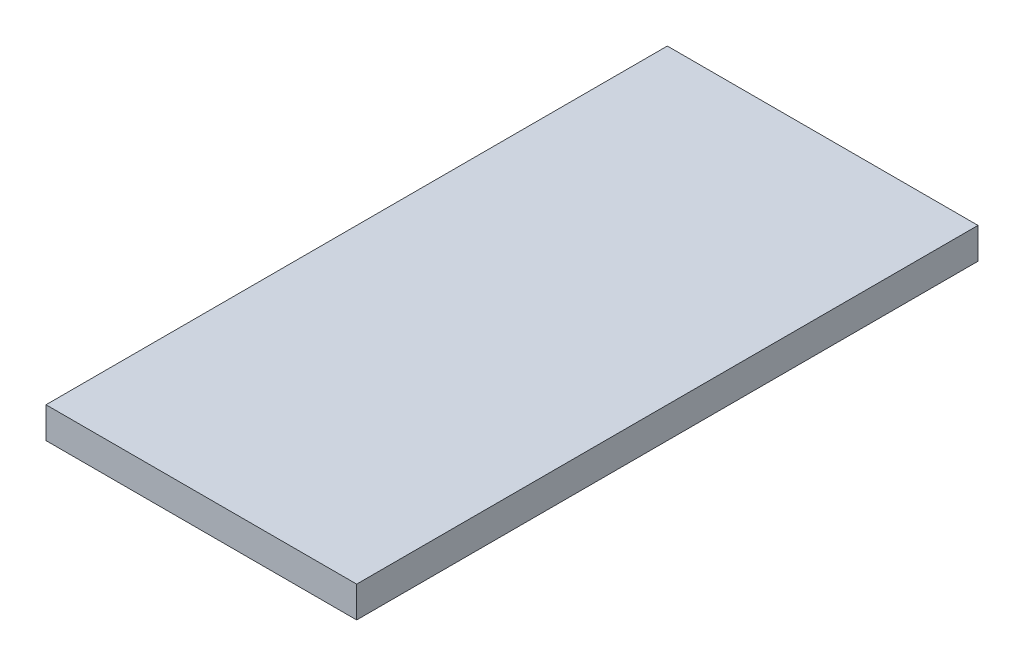
ISO-10303-21;
HEADER;
FILE_DESCRIPTION(('STEP AP214'),'2;1');
FILE_NAME('part.step','',(''),(''),'','','');
FILE_SCHEMA(('AUTOMOTIVE_DESIGN { 1 0 10303 214 1 1 1 1 }'));
ENDSEC;
DATA;
#1=APPLICATION_CONTEXT('core data for automotive mechanical design processes');
#2=APPLICATION_PROTOCOL_DEFINITION('international standard','automotive_design',2000,#1);
#3=PRODUCT_CONTEXT('',#1,'mechanical');
#4=PRODUCT('Part','Part','',(#3));
#5=PRODUCT_RELATED_PRODUCT_CATEGORY('part','',(#4));
#6=PRODUCT_DEFINITION_FORMATION('','',#4);
#7=PRODUCT_DEFINITION_CONTEXT('part definition',#1,'design');
#8=PRODUCT_DEFINITION('design','',#6,#7);
#9=PRODUCT_DEFINITION_SHAPE('','',#8);
#10=(LENGTH_UNIT() NAMED_UNIT(*) SI_UNIT(.MILLI.,.METRE.));
#11=(NAMED_UNIT(*) PLANE_ANGLE_UNIT() SI_UNIT($,.RADIAN.));
#12=(NAMED_UNIT(*) SI_UNIT($,.STERADIAN.) SOLID_ANGLE_UNIT());
#13=UNCERTAINTY_MEASURE_WITH_UNIT(LENGTH_MEASURE(1.E-05),#10,'distance_accuracy_value','');
#14=(GEOMETRIC_REPRESENTATION_CONTEXT(3) GLOBAL_UNCERTAINTY_ASSIGNED_CONTEXT((#13)) GLOBAL_UNIT_ASSIGNED_CONTEXT((#10,
#11,#12)) REPRESENTATION_CONTEXT('',''));
#15=CARTESIAN_POINT('',(0.,0.,0.));
#16=DIRECTION('',(0.,0.,1.));
#17=DIRECTION('',(1.,0.,0.));
#18=AXIS2_PLACEMENT_3D('',#15,#16,#17);
#19=CARTESIAN_POINT('',(50.,10.,100.));
#20=DIRECTION('',(-1.,0.,0.));
#21=DIRECTION('',(0.,0.,1.));
#22=AXIS2_PLACEMENT_3D('',#19,#20,#21);
#23=PLANE('',#22);
#24=DIRECTION('',(0.,0.,-1.));
#25=VECTOR('',#24,1.);
#26=CARTESIAN_POINT('',(50.,0.,100.));
#27=LINE('',#26,#25);
#28=CARTESIAN_POINT('',(50.,0.,100.));
#29=VERTEX_POINT('',#28);
#30=CARTESIAN_POINT('',(50.,0.,-100.));
#31=VERTEX_POINT('',#30);
#32=EDGE_CURVE('E106',#29,#31,#27,.T.);
#33=ORIENTED_EDGE('',*,*,#32,.T.);
#34=DIRECTION('',(0.,-1.,0.));
#35=VECTOR('',#34,1.);
#36=CARTESIAN_POINT('',(50.,10.,-100.));
#37=LINE('',#36,#35);
#38=CARTESIAN_POINT('',(50.,10.,-100.));
#39=VERTEX_POINT('',#38);
#40=EDGE_CURVE('E11',#39,#31,#37,.T.);
#41=ORIENTED_EDGE('',*,*,#40,.F.);
#42=DIRECTION('',(0.,0.,-1.));
#43=VECTOR('',#42,1.);
#44=CARTESIAN_POINT('',(50.,10.,100.));
#45=LINE('',#44,#43);
#46=CARTESIAN_POINT('',(50.,10.,100.));
#47=VERTEX_POINT('',#46);
#48=EDGE_CURVE('E94',#47,#39,#45,.T.);
#49=ORIENTED_EDGE('',*,*,#48,.F.);
#50=DIRECTION('',(0.,-1.,0.));
#51=VECTOR('',#50,1.);
#52=CARTESIAN_POINT('',(50.,10.,100.));
#53=LINE('',#52,#51);
#54=EDGE_CURVE('E102',#47,#29,#53,.T.);
#55=ORIENTED_EDGE('',*,*,#54,.T.);
#56=EDGE_LOOP('',(#33,#41,#49,#55));
#57=FACE_BOUND('',#56,.T.);
#58=ADVANCED_FACE('F43',(#57),#23,.F.);
#59=CARTESIAN_POINT('',(-50.,10.,-100.));
#60=DIRECTION('',(0.,0.,1.));
#61=DIRECTION('',(1.,0.,0.));
#62=AXIS2_PLACEMENT_3D('',#59,#60,#61);
#63=PLANE('',#62);
#64=DIRECTION('',(-1.,0.,0.));
#65=VECTOR('',#64,1.);
#66=CARTESIAN_POINT('',(-50.,0.,-100.));
#67=LINE('',#66,#65);
#68=CARTESIAN_POINT('',(-50.,0.,-100.));
#69=VERTEX_POINT('',#68);
#70=EDGE_CURVE('E98',#31,#69,#67,.T.);
#71=ORIENTED_EDGE('',*,*,#70,.T.);
#72=DIRECTION('',(0.,-1.,0.));
#73=VECTOR('',#72,1.);
#74=CARTESIAN_POINT('',(-50.,10.,-100.));
#75=LINE('',#74,#73);
#76=CARTESIAN_POINT('',(-50.,10.,-100.));
#77=VERTEX_POINT('',#76);
#78=EDGE_CURVE('E51',#77,#69,#75,.T.);
#79=ORIENTED_EDGE('',*,*,#78,.F.);
#80=DIRECTION('',(-1.,0.,0.));
#81=VECTOR('',#80,1.);
#82=CARTESIAN_POINT('',(-50.,10.,-100.));
#83=LINE('',#82,#81);
#84=EDGE_CURVE('E89',#39,#77,#83,.T.);
#85=ORIENTED_EDGE('',*,*,#84,.F.);
#86=ORIENTED_EDGE('',*,*,#40,.T.);
#87=EDGE_LOOP('',(#71,#79,#85,#86));
#88=FACE_BOUND('',#87,.T.);
#89=ADVANCED_FACE('F97',(#88),#63,.F.);
#90=CARTESIAN_POINT('',(-50.,10.,100.));
#91=DIRECTION('',(1.,0.,0.));
#92=DIRECTION('',(0.,0.,-1.));
#93=AXIS2_PLACEMENT_3D('',#90,#91,#92);
#94=PLANE('',#93);
#95=DIRECTION('',(0.,0.,1.));
#96=VECTOR('',#95,1.);
#97=CARTESIAN_POINT('',(-50.,0.,100.));
#98=LINE('',#97,#96);
#99=CARTESIAN_POINT('',(-50.,0.,100.));
#100=VERTEX_POINT('',#99);
#101=EDGE_CURVE('E76',#69,#100,#98,.T.);
#102=ORIENTED_EDGE('',*,*,#101,.T.);
#103=DIRECTION('',(0.,-1.,0.));
#104=VECTOR('',#103,1.);
#105=CARTESIAN_POINT('',(-50.,10.,100.));
#106=LINE('',#105,#104);
#107=CARTESIAN_POINT('',(-50.,10.,100.));
#108=VERTEX_POINT('',#107);
#109=EDGE_CURVE('E99',#108,#100,#106,.T.);
#110=ORIENTED_EDGE('',*,*,#109,.F.);
#111=DIRECTION('',(0.,0.,1.));
#112=VECTOR('',#111,1.);
#113=CARTESIAN_POINT('',(-50.,10.,100.));
#114=LINE('',#113,#112);
#115=EDGE_CURVE('E92',#77,#108,#114,.T.);
#116=ORIENTED_EDGE('',*,*,#115,.F.);
#117=ORIENTED_EDGE('',*,*,#78,.T.);
#118=EDGE_LOOP('',(#102,#110,#116,#117));
#119=FACE_BOUND('',#118,.T.);
#120=ADVANCED_FACE('F100',(#119),#94,.F.);
#121=CARTESIAN_POINT('',(-50.,10.,100.));
#122=DIRECTION('',(0.,0.,-1.));
#123=DIRECTION('',(-1.,0.,0.));
#124=AXIS2_PLACEMENT_3D('',#121,#122,#123);
#125=PLANE('',#124);
#126=DIRECTION('',(1.,0.,0.));
#127=VECTOR('',#126,1.);
#128=CARTESIAN_POINT('',(-50.,0.,100.));
#129=LINE('',#128,#127);
#130=EDGE_CURVE('E82',#100,#29,#129,.T.);
#131=ORIENTED_EDGE('',*,*,#130,.T.);
#132=ORIENTED_EDGE('',*,*,#54,.F.);
#133=DIRECTION('',(1.,0.,0.));
#134=VECTOR('',#133,1.);
#135=CARTESIAN_POINT('',(-50.,10.,100.));
#136=LINE('',#135,#134);
#137=EDGE_CURVE('E59',#108,#47,#136,.T.);
#138=ORIENTED_EDGE('',*,*,#137,.F.);
#139=ORIENTED_EDGE('',*,*,#109,.T.);
#140=EDGE_LOOP('',(#131,#132,#138,#139));
#141=FACE_BOUND('',#140,.T.);
#142=ADVANCED_FACE('F113',(#141),#125,.F.);
#143=CARTESIAN_POINT('',(0.,10.,0.));
#144=DIRECTION('',(0.,-1.,0.));
#145=DIRECTION('',(0.,0.,-1.));
#146=AXIS2_PLACEMENT_3D('',#143,#144,#145);
#147=PLANE('',#146);
#148=ORIENTED_EDGE('',*,*,#48,.T.);
#149=ORIENTED_EDGE('',*,*,#84,.T.);
#150=ORIENTED_EDGE('',*,*,#115,.T.);
#151=ORIENTED_EDGE('',*,*,#137,.T.);
#152=EDGE_LOOP('',(#148,#149,#150,#151));
#153=FACE_BOUND('',#152,.T.);
#154=ADVANCED_FACE('F90',(#153),#147,.F.);
#155=CARTESIAN_POINT('',(0.,0.,0.));
#156=DIRECTION('',(0.,-1.,0.));
#157=DIRECTION('',(0.,0.,-1.));
#158=AXIS2_PLACEMENT_3D('',#155,#156,#157);
#159=PLANE('',#158);
#160=ORIENTED_EDGE('',*,*,#32,.F.);
#161=ORIENTED_EDGE('',*,*,#130,.F.);
#162=ORIENTED_EDGE('',*,*,#101,.F.);
#163=ORIENTED_EDGE('',*,*,#70,.F.);
#164=EDGE_LOOP('',(#160,#161,#162,#163));
#165=FACE_BOUND('',#164,.T.);
#166=ADVANCED_FACE('F116',(#165),#159,.T.);
#167=CLOSED_SHELL('',(#58,#89,#120,#142,#154,#166));
#168=MANIFOLD_SOLID_BREP('B2',#167);
#169=ADVANCED_BREP_SHAPE_REPRESENTATION('',(#18,#168),#14);
#170=SHAPE_DEFINITION_REPRESENTATION(#9,#169);
ENDSEC;
END-ISO-10303-21;
